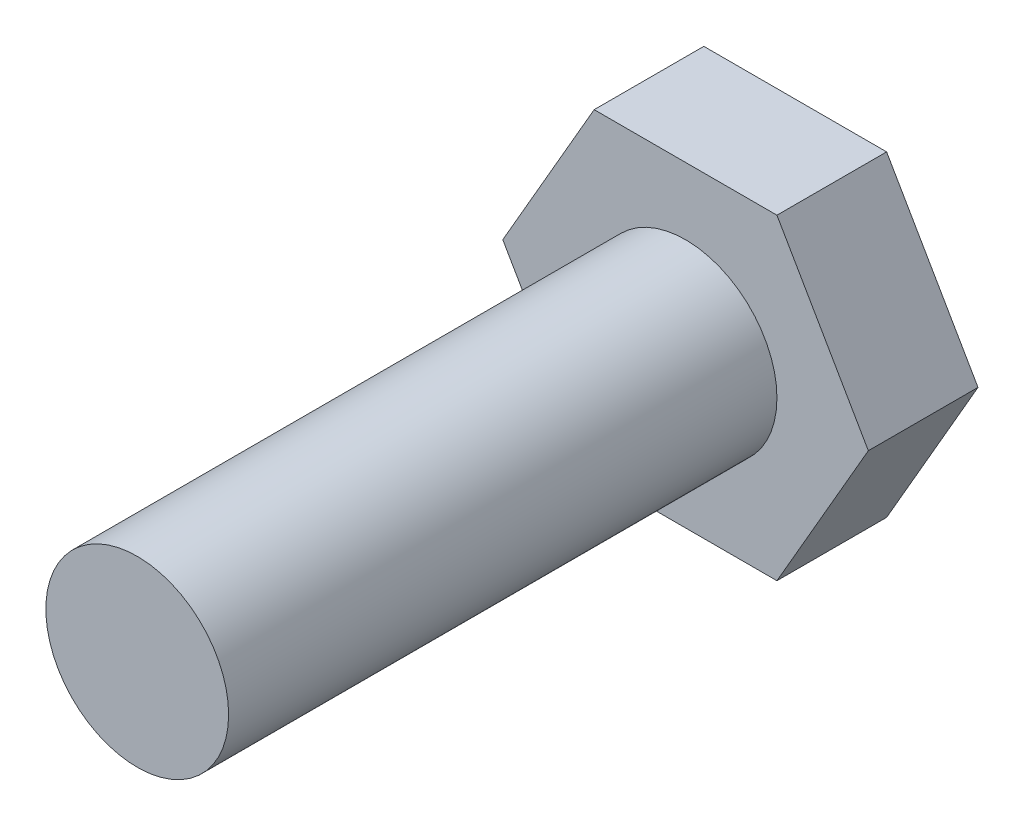
ISO-10303-21;
HEADER;
FILE_DESCRIPTION(('STEP AP214'),'2;1');
FILE_NAME('part.step','',(''),(''),'','','');
FILE_SCHEMA(('AUTOMOTIVE_DESIGN { 1 0 10303 214 1 1 1 1 }'));
ENDSEC;
DATA;
#1=APPLICATION_CONTEXT('core data for automotive mechanical design processes');
#2=APPLICATION_PROTOCOL_DEFINITION('international standard','automotive_design',2000,#1);
#3=PRODUCT_CONTEXT('',#1,'mechanical');
#4=PRODUCT('Part','Part','',(#3));
#5=PRODUCT_RELATED_PRODUCT_CATEGORY('part','',(#4));
#6=PRODUCT_DEFINITION_FORMATION('','',#4);
#7=PRODUCT_DEFINITION_CONTEXT('part definition',#1,'design');
#8=PRODUCT_DEFINITION('design','',#6,#7);
#9=PRODUCT_DEFINITION_SHAPE('','',#8);
#10=(LENGTH_UNIT() NAMED_UNIT(*) SI_UNIT(.MILLI.,.METRE.));
#11=(NAMED_UNIT(*) PLANE_ANGLE_UNIT() SI_UNIT($,.RADIAN.));
#12=(NAMED_UNIT(*) SI_UNIT($,.STERADIAN.) SOLID_ANGLE_UNIT());
#13=UNCERTAINTY_MEASURE_WITH_UNIT(LENGTH_MEASURE(1.E-05),#10,'distance_accuracy_value','');
#14=(GEOMETRIC_REPRESENTATION_CONTEXT(3) GLOBAL_UNCERTAINTY_ASSIGNED_CONTEXT((#13)) GLOBAL_UNIT_ASSIGNED_CONTEXT((#10,
#11,#12)) REPRESENTATION_CONTEXT('',''));
#15=CARTESIAN_POINT('',(0.,0.,0.));
#16=DIRECTION('',(0.,0.,1.));
#17=DIRECTION('',(1.,0.,0.));
#18=AXIS2_PLACEMENT_3D('',#15,#16,#17);
#19=CARTESIAN_POINT('',(5.0000000000001,-8.66025403784433,6.));
#20=DIRECTION('',(-0.866025403784441,0.499999999999995,0.));
#21=DIRECTION('',(-0.499999999999995,-0.866025403784441,0.));
#22=AXIS2_PLACEMENT_3D('',#19,#20,#21);
#23=PLANE('',#22);
#24=DIRECTION('',(0.499999999999995,0.866025403784441,0.));
#25=VECTOR('',#24,1.);
#26=CARTESIAN_POINT('',(5.0000000000001,-8.66025403784433,0.));
#27=LINE('',#26,#25);
#28=CARTESIAN_POINT('',(5.0000000000001,-8.66025403784433,0.));
#29=VERTEX_POINT('',#28);
#30=CARTESIAN_POINT('',(10.,0.,0.));
#31=VERTEX_POINT('',#30);
#32=EDGE_CURVE('E127',#29,#31,#27,.T.);
#33=ORIENTED_EDGE('',*,*,#32,.T.);
#34=DIRECTION('',(0.,0.,-1.));
#35=VECTOR('',#34,1.);
#36=CARTESIAN_POINT('',(10.,0.,6.));
#37=LINE('',#36,#35);
#38=CARTESIAN_POINT('',(10.,0.,6.));
#39=VERTEX_POINT('',#38);
#40=EDGE_CURVE('E44',#39,#31,#37,.T.);
#41=ORIENTED_EDGE('',*,*,#40,.F.);
#42=DIRECTION('',(0.499999999999995,0.866025403784441,0.));
#43=VECTOR('',#42,1.);
#44=CARTESIAN_POINT('',(5.0000000000001,-8.66025403784433,6.));
#45=LINE('',#44,#43);
#46=CARTESIAN_POINT('',(5.0000000000001,-8.66025403784433,6.));
#47=VERTEX_POINT('',#46);
#48=EDGE_CURVE('E138',#47,#39,#45,.T.);
#49=ORIENTED_EDGE('',*,*,#48,.F.);
#50=DIRECTION('',(0.,0.,-1.));
#51=VECTOR('',#50,1.);
#52=CARTESIAN_POINT('',(5.0000000000001,-8.66025403784433,6.));
#53=LINE('',#52,#51);
#54=EDGE_CURVE('E123',#47,#29,#53,.T.);
#55=ORIENTED_EDGE('',*,*,#54,.T.);
#56=EDGE_LOOP('',(#33,#41,#49,#55));
#57=FACE_BOUND('',#56,.T.);
#58=ADVANCED_FACE('F41',(#57),#23,.F.);
#59=CARTESIAN_POINT('',(10.,0.,6.));
#60=DIRECTION('',(-0.866025403784438,-0.500000000000001,0.));
#61=DIRECTION('',(0.500000000000001,-0.866025403784438,0.));
#62=AXIS2_PLACEMENT_3D('',#59,#60,#61);
#63=PLANE('',#62);
#64=DIRECTION('',(-0.500000000000001,0.866025403784438,0.));
#65=VECTOR('',#64,1.);
#66=CARTESIAN_POINT('',(10.,0.,0.));
#67=LINE('',#66,#65);
#68=CARTESIAN_POINT('',(4.99999999999998,8.6602540378444,0.));
#69=VERTEX_POINT('',#68);
#70=EDGE_CURVE('E130',#31,#69,#67,.T.);
#71=ORIENTED_EDGE('',*,*,#70,.T.);
#72=DIRECTION('',(0.,0.,-1.));
#73=VECTOR('',#72,1.);
#74=CARTESIAN_POINT('',(4.99999999999998,8.6602540378444,6.));
#75=LINE('',#74,#73);
#76=CARTESIAN_POINT('',(4.99999999999998,8.6602540378444,6.));
#77=VERTEX_POINT('',#76);
#78=EDGE_CURVE('E141',#77,#69,#75,.T.);
#79=ORIENTED_EDGE('',*,*,#78,.F.);
#80=DIRECTION('',(-0.500000000000001,0.866025403784438,0.));
#81=VECTOR('',#80,1.);
#82=CARTESIAN_POINT('',(10.,0.,6.));
#83=LINE('',#82,#81);
#84=EDGE_CURVE('E96',#39,#77,#83,.T.);
#85=ORIENTED_EDGE('',*,*,#84,.F.);
#86=ORIENTED_EDGE('',*,*,#40,.T.);
#87=EDGE_LOOP('',(#71,#79,#85,#86));
#88=FACE_BOUND('',#87,.T.);
#89=ADVANCED_FACE('F146',(#88),#63,.F.);
#90=CARTESIAN_POINT('',(4.99999999999998,8.6602540378444,6.));
#91=DIRECTION('',(0.,-1.,0.));
#92=DIRECTION('',(1.,0.,0.));
#93=AXIS2_PLACEMENT_3D('',#90,#91,#92);
#94=PLANE('',#93);
#95=DIRECTION('',(-1.,0.,0.));
#96=VECTOR('',#95,1.);
#97=CARTESIAN_POINT('',(4.99999999999998,8.6602540378444,0.));
#98=LINE('',#97,#96);
#99=CARTESIAN_POINT('',(-5.00000000000004,8.66025403784436,0.));
#100=VERTEX_POINT('',#99);
#101=EDGE_CURVE('E133',#69,#100,#98,.T.);
#102=ORIENTED_EDGE('',*,*,#101,.T.);
#103=DIRECTION('',(0.,0.,-1.));
#104=VECTOR('',#103,1.);
#105=CARTESIAN_POINT('',(-5.00000000000004,8.66025403784436,6.));
#106=LINE('',#105,#104);
#107=CARTESIAN_POINT('',(-5.00000000000004,8.66025403784436,6.));
#108=VERTEX_POINT('',#107);
#109=EDGE_CURVE('E118',#108,#100,#106,.T.);
#110=ORIENTED_EDGE('',*,*,#109,.F.);
#111=DIRECTION('',(-1.,0.,0.));
#112=VECTOR('',#111,1.);
#113=CARTESIAN_POINT('',(4.99999999999998,8.6602540378444,6.));
#114=LINE('',#113,#112);
#115=EDGE_CURVE('E109',#77,#108,#114,.T.);
#116=ORIENTED_EDGE('',*,*,#115,.F.);
#117=ORIENTED_EDGE('',*,*,#78,.T.);
#118=EDGE_LOOP('',(#102,#110,#116,#117));
#119=FACE_BOUND('',#118,.T.);
#120=ADVANCED_FACE('F152',(#119),#94,.F.);
#121=CARTESIAN_POINT('',(-5.00000000000004,8.66025403784436,6.));
#122=DIRECTION('',(0.866025403784441,-0.499999999999995,0.));
#123=DIRECTION('',(0.499999999999995,0.866025403784442,0.));
#124=AXIS2_PLACEMENT_3D('',#121,#122,#123);
#125=PLANE('',#124);
#126=DIRECTION('',(-0.499999999999995,-0.866025403784442,0.));
#127=VECTOR('',#126,1.);
#128=CARTESIAN_POINT('',(-5.00000000000004,8.66025403784436,0.));
#129=LINE('',#128,#127);
#130=CARTESIAN_POINT('',(-10.,0.,0.));
#131=VERTEX_POINT('',#130);
#132=EDGE_CURVE('E117',#100,#131,#129,.T.);
#133=ORIENTED_EDGE('',*,*,#132,.T.);
#134=DIRECTION('',(0.,0.,-1.));
#135=VECTOR('',#134,1.);
#136=CARTESIAN_POINT('',(-10.,0.,6.));
#137=LINE('',#136,#135);
#138=CARTESIAN_POINT('',(-10.,0.,6.));
#139=VERTEX_POINT('',#138);
#140=EDGE_CURVE('E114',#139,#131,#137,.T.);
#141=ORIENTED_EDGE('',*,*,#140,.F.);
#142=DIRECTION('',(-0.499999999999995,-0.866025403784442,0.));
#143=VECTOR('',#142,1.);
#144=CARTESIAN_POINT('',(-5.00000000000004,8.66025403784436,6.));
#145=LINE('',#144,#143);
#146=EDGE_CURVE('E103',#108,#139,#145,.T.);
#147=ORIENTED_EDGE('',*,*,#146,.F.);
#148=ORIENTED_EDGE('',*,*,#109,.T.);
#149=EDGE_LOOP('',(#133,#141,#147,#148));
#150=FACE_BOUND('',#149,.T.);
#151=ADVANCED_FACE('F115',(#150),#125,.F.);
#152=CARTESIAN_POINT('',(-10.,0.,6.));
#153=DIRECTION('',(0.866025403784435,0.500000000000007,0.));
#154=DIRECTION('',(-0.500000000000007,0.866025403784435,0.));
#155=AXIS2_PLACEMENT_3D('',#152,#153,#154);
#156=PLANE('',#155);
#157=DIRECTION('',(0.500000000000007,-0.866025403784434,0.));
#158=VECTOR('',#157,1.);
#159=CARTESIAN_POINT('',(-10.,0.,0.));
#160=LINE('',#159,#158);
#161=CARTESIAN_POINT('',(-4.99999999999992,-8.66025403784443,0.));
#162=VERTEX_POINT('',#161);
#163=EDGE_CURVE('E81',#131,#162,#160,.T.);
#164=ORIENTED_EDGE('',*,*,#163,.T.);
#165=DIRECTION('',(0.,0.,-1.));
#166=VECTOR('',#165,1.);
#167=CARTESIAN_POINT('',(-4.99999999999992,-8.66025403784443,6.));
#168=LINE('',#167,#166);
#169=CARTESIAN_POINT('',(-4.99999999999992,-8.66025403784443,6.));
#170=VERTEX_POINT('',#169);
#171=EDGE_CURVE('E119',#170,#162,#168,.T.);
#172=ORIENTED_EDGE('',*,*,#171,.F.);
#173=DIRECTION('',(0.500000000000007,-0.866025403784434,0.));
#174=VECTOR('',#173,1.);
#175=CARTESIAN_POINT('',(-10.,0.,6.));
#176=LINE('',#175,#174);
#177=EDGE_CURVE('E107',#139,#170,#176,.T.);
#178=ORIENTED_EDGE('',*,*,#177,.F.);
#179=ORIENTED_EDGE('',*,*,#140,.T.);
#180=EDGE_LOOP('',(#164,#172,#178,#179));
#181=FACE_BOUND('',#180,.T.);
#182=ADVANCED_FACE('F121',(#181),#156,.F.);
#183=CARTESIAN_POINT('',(-4.99999999999992,-8.66025403784443,6.));
#184=DIRECTION('',(0.,1.,0.));
#185=DIRECTION('',(-1.,0.,0.));
#186=AXIS2_PLACEMENT_3D('',#183,#184,#185);
#187=PLANE('',#186);
#188=DIRECTION('',(1.,0.,0.));
#189=VECTOR('',#188,1.);
#190=CARTESIAN_POINT('',(-4.99999999999992,-8.66025403784443,0.));
#191=LINE('',#190,#189);
#192=EDGE_CURVE('E87',#162,#29,#191,.T.);
#193=ORIENTED_EDGE('',*,*,#192,.T.);
#194=ORIENTED_EDGE('',*,*,#54,.F.);
#195=DIRECTION('',(1.,0.,0.));
#196=VECTOR('',#195,1.);
#197=CARTESIAN_POINT('',(-4.99999999999992,-8.66025403784443,6.));
#198=LINE('',#197,#196);
#199=EDGE_CURVE('E58',#170,#47,#198,.T.);
#200=ORIENTED_EDGE('',*,*,#199,.F.);
#201=ORIENTED_EDGE('',*,*,#171,.T.);
#202=EDGE_LOOP('',(#193,#194,#200,#201));
#203=FACE_BOUND('',#202,.T.);
#204=ADVANCED_FACE('F168',(#203),#187,.F.);
#205=CARTESIAN_POINT('',(0.,0.,6.));
#206=DIRECTION('',(0.,0.,1.));
#207=DIRECTION('',(1.,0.,0.));
#208=AXIS2_PLACEMENT_3D('',#205,#206,#207);
#209=PLANE('',#208);
#210=CARTESIAN_POINT('',(0.,0.,6.));
#211=DIRECTION('',(0.,0.,1.));
#212=DIRECTION('',(1.,0.,0.));
#213=AXIS2_PLACEMENT_3D('',#210,#211,#212);
#214=CIRCLE('',#213,5.);
#215=CARTESIAN_POINT('',(5.,0.,6.));
#216=VERTEX_POINT('',#215);
#217=EDGE_CURVE('E11',#216,#216,#214,.T.);
#218=ORIENTED_EDGE('',*,*,#217,.F.);
#219=EDGE_LOOP('',(#218));
#220=FACE_BOUND('',#219,.T.);
#221=ORIENTED_EDGE('',*,*,#48,.T.);
#222=ORIENTED_EDGE('',*,*,#84,.T.);
#223=ORIENTED_EDGE('',*,*,#115,.T.);
#224=ORIENTED_EDGE('',*,*,#146,.T.);
#225=ORIENTED_EDGE('',*,*,#177,.T.);
#226=ORIENTED_EDGE('',*,*,#199,.T.);
#227=EDGE_LOOP('',(#221,#222,#223,#224,#225,#226));
#228=FACE_BOUND('',#227,.T.);
#229=ADVANCED_FACE('F105',(#220,#228),#209,.T.);
#230=CARTESIAN_POINT('',(0.,0.,0.));
#231=DIRECTION('',(0.,0.,1.));
#232=DIRECTION('',(1.,0.,0.));
#233=AXIS2_PLACEMENT_3D('',#230,#231,#232);
#234=PLANE('',#233);
#235=ORIENTED_EDGE('',*,*,#32,.F.);
#236=ORIENTED_EDGE('',*,*,#192,.F.);
#237=ORIENTED_EDGE('',*,*,#163,.F.);
#238=ORIENTED_EDGE('',*,*,#132,.F.);
#239=ORIENTED_EDGE('',*,*,#101,.F.);
#240=ORIENTED_EDGE('',*,*,#70,.F.);
#241=EDGE_LOOP('',(#235,#236,#237,#238,#239,#240));
#242=FACE_BOUND('',#241,.T.);
#243=ADVANCED_FACE('F151',(#242),#234,.F.);
#244=CARTESIAN_POINT('',(0.,0.,36.));
#245=DIRECTION('',(0.,0.,-1.));
#246=DIRECTION('',(-1.,0.,0.));
#247=AXIS2_PLACEMENT_3D('',#244,#245,#246);
#248=CYLINDRICAL_SURFACE('',#247,5.);
#249=CARTESIAN_POINT('',(0.,0.,36.));
#250=DIRECTION('',(0.,0.,1.));
#251=DIRECTION('',(1.,0.,0.));
#252=AXIS2_PLACEMENT_3D('',#249,#250,#251);
#253=CIRCLE('',#252,5.);
#254=CARTESIAN_POINT('',(5.,0.,36.));
#255=VERTEX_POINT('',#254);
#256=EDGE_CURVE('E131',#255,#255,#253,.T.);
#257=ORIENTED_EDGE('',*,*,#256,.F.);
#258=EDGE_LOOP('',(#257));
#259=FACE_BOUND('',#258,.T.);
#260=ORIENTED_EDGE('',*,*,#217,.T.);
#261=EDGE_LOOP('',(#260));
#262=FACE_BOUND('',#261,.T.);
#263=ADVANCED_FACE('F161',(#259,#262),#248,.T.);
#264=CARTESIAN_POINT('',(0.,0.,36.));
#265=DIRECTION('',(0.,0.,1.));
#266=DIRECTION('',(1.,0.,0.));
#267=AXIS2_PLACEMENT_3D('',#264,#265,#266);
#268=PLANE('',#267);
#269=ORIENTED_EDGE('',*,*,#256,.T.);
#270=EDGE_LOOP('',(#269));
#271=FACE_BOUND('',#270,.T.);
#272=ADVANCED_FACE('F159',(#271),#268,.T.);
#273=CLOSED_SHELL('',(#58,#89,#120,#151,#182,#204,#229,#243,#263,#272));
#274=MANIFOLD_SOLID_BREP('B2',#273);
#275=ADVANCED_BREP_SHAPE_REPRESENTATION('',(#18,#274),#14);
#276=SHAPE_DEFINITION_REPRESENTATION(#9,#275);
ENDSEC;
END-ISO-10303-21;
